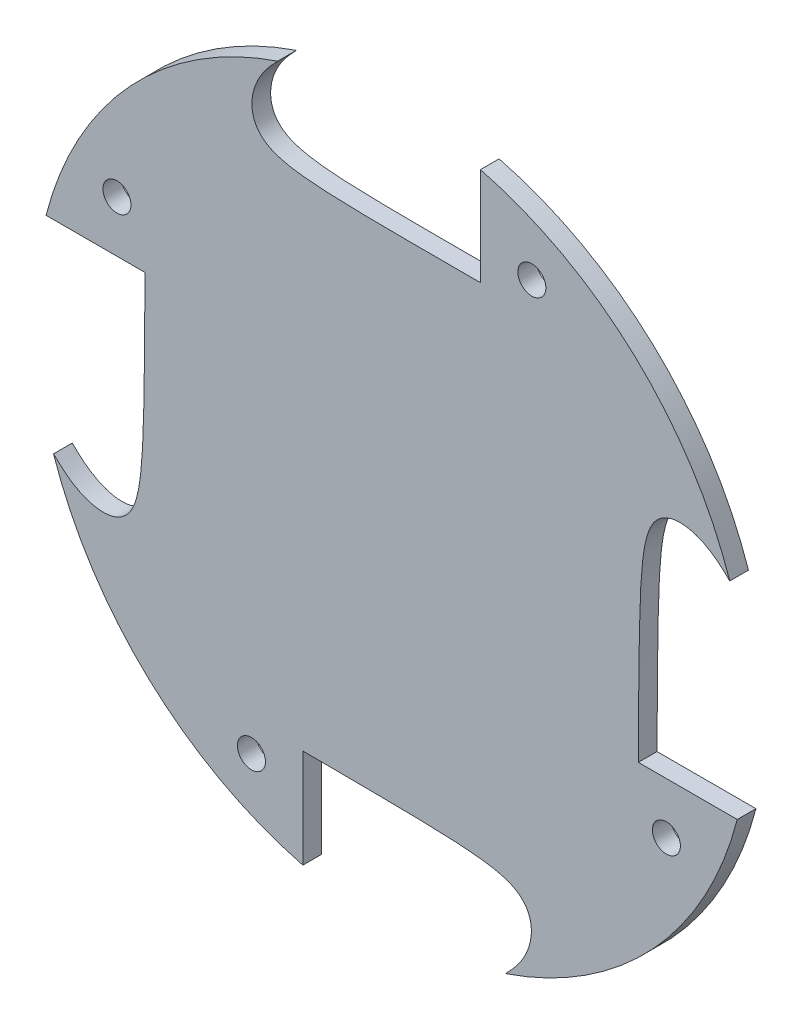
ISO-10303-21;
HEADER;
FILE_DESCRIPTION(('STEP AP214'),'2;1');
FILE_NAME('part.step','',(''),(''),'','','');
FILE_SCHEMA(('AUTOMOTIVE_DESIGN { 1 0 10303 214 1 1 1 1 }'));
ENDSEC;
DATA;
#1=APPLICATION_CONTEXT('core data for automotive mechanical design processes');
#2=APPLICATION_PROTOCOL_DEFINITION('international standard','automotive_design',2000,#1);
#3=PRODUCT_CONTEXT('',#1,'mechanical');
#4=PRODUCT('Part','Part','',(#3));
#5=PRODUCT_RELATED_PRODUCT_CATEGORY('part','',(#4));
#6=PRODUCT_DEFINITION_FORMATION('','',#4);
#7=PRODUCT_DEFINITION_CONTEXT('part definition',#1,'design');
#8=PRODUCT_DEFINITION('design','',#6,#7);
#9=PRODUCT_DEFINITION_SHAPE('','',#8);
#10=(LENGTH_UNIT() NAMED_UNIT(*) SI_UNIT(.MILLI.,.METRE.));
#11=(NAMED_UNIT(*) PLANE_ANGLE_UNIT() SI_UNIT($,.RADIAN.));
#12=(NAMED_UNIT(*) SI_UNIT($,.STERADIAN.) SOLID_ANGLE_UNIT());
#13=UNCERTAINTY_MEASURE_WITH_UNIT(LENGTH_MEASURE(1.E-05),#10,'distance_accuracy_value','');
#14=(GEOMETRIC_REPRESENTATION_CONTEXT(3) GLOBAL_UNCERTAINTY_ASSIGNED_CONTEXT((#13)) GLOBAL_UNIT_ASSIGNED_CONTEXT((#10,
#11,#12)) REPRESENTATION_CONTEXT('',''));
#15=CARTESIAN_POINT('',(0.,0.,0.));
#16=DIRECTION('',(0.,0.,1.));
#17=DIRECTION('',(1.,0.,0.));
#18=AXIS2_PLACEMENT_3D('',#15,#16,#17);
#19=CARTESIAN_POINT('',(24.392810523915,-72.348554199406,4.));
#20=CARTESIAN_POINT('',(27.0406670726884,-69.5410863292131,4.));
#21=CARTESIAN_POINT('',(29.0891629376006,-67.4285749685224,4.));
#22=CARTESIAN_POINT('',(30.2414418616137,-64.3558311711541,4.));
#23=CARTESIAN_POINT('',(31.0736433067342,-60.9630098948933,4.));
#24=CARTESIAN_POINT('',(30.5615193405061,-59.0425450215381,4.));
#25=CARTESIAN_POINT('',(29.2171939291575,-56.6739716777334,4.));
#26=CARTESIAN_POINT('',(27.4887755431378,-54.2413828381502,4.));
#27=CARTESIAN_POINT('',(25.1059549538443,-52.9999999999996,4.));
#28=CARTESIAN_POINT('',(17.3743272101338,-52.9999999999997,4.));
#29=CARTESIAN_POINT('',(-18.9999999999992,-52.782560411168,4.));
#30=B_SPLINE_CURVE_WITH_KNOTS('',10,(#19,#20,#21,#22,#23,#24,#25,#26,#27,#28,#29),.UNSPECIFIED.,
.F.,.F.,(11,11),(0.,1.),.UNSPECIFIED.);
#31=DIRECTION('',(0.,0.,-1.));
#32=VECTOR('',#31,1.);
#33=SURFACE_OF_LINEAR_EXTRUSION('',#30,#32);
#34=CARTESIAN_POINT('',(24.392810523915,-72.348554199406,0.));
#35=CARTESIAN_POINT('',(27.0406670726884,-69.5410863292131,0.));
#36=CARTESIAN_POINT('',(29.0891629376006,-67.4285749685224,0.));
#37=CARTESIAN_POINT('',(30.2414418616137,-64.3558311711541,0.));
#38=CARTESIAN_POINT('',(31.0736433067342,-60.9630098948933,0.));
#39=CARTESIAN_POINT('',(30.5615193405061,-59.0425450215381,0.));
#40=CARTESIAN_POINT('',(29.2171939291575,-56.6739716777334,0.));
#41=CARTESIAN_POINT('',(27.4887755431378,-54.2413828381502,0.));
#42=CARTESIAN_POINT('',(25.1059549538443,-52.9999999999996,0.));
#43=CARTESIAN_POINT('',(17.3743272101338,-52.9999999999997,0.));
#44=CARTESIAN_POINT('',(-18.9999999999992,-52.782560411168,0.));
#45=B_SPLINE_CURVE_WITH_KNOTS('',10,(#34,#35,#36,#37,#38,#39,#40,#41,#42,#43,#44),.UNSPECIFIED.,
.F.,.F.,(11,11),(0.,1.),.UNSPECIFIED.);
#46=CARTESIAN_POINT('',(24.392810523915,-72.348554199406,0.));
#47=VERTEX_POINT('',#46);
#48=CARTESIAN_POINT('',(-18.9999999999992,-52.782560411168,0.));
#49=VERTEX_POINT('',#48);
#50=EDGE_CURVE('E273',#47,#49,#45,.T.);
#51=ORIENTED_EDGE('',*,*,#50,.F.);
#52=DIRECTION('',(0.,0.,-1.));
#53=VECTOR('',#52,1.);
#54=CARTESIAN_POINT('',(24.392810523915,-72.348554199406,4.));
#55=LINE('',#54,#53);
#56=CARTESIAN_POINT('',(24.392810523915,-72.348554199406,4.));
#57=VERTEX_POINT('',#56);
#58=EDGE_CURVE('E11',#57,#47,#55,.T.);
#59=ORIENTED_EDGE('',*,*,#58,.F.);
#60=CARTESIAN_POINT('',(-18.9999999999992,-52.782560411168,4.));
#61=VERTEX_POINT('',#60);
#62=EDGE_CURVE('E323',#57,#61,#30,.T.);
#63=ORIENTED_EDGE('',*,*,#62,.T.);
#64=DIRECTION('',(0.,0.,-1.));
#65=VECTOR('',#64,1.);
#66=CARTESIAN_POINT('',(-18.9999999999992,-52.782560411168,4.));
#67=LINE('',#66,#65);
#68=EDGE_CURVE('E111',#61,#49,#67,.T.);
#69=ORIENTED_EDGE('',*,*,#68,.T.);
#70=EDGE_LOOP('',(#51,#59,#63,#69));
#71=FACE_BOUND('',#70,.T.);
#72=ADVANCED_FACE('F42',(#71),#33,.T.);
#73=CARTESIAN_POINT('',(0.,0.,4.));
#74=DIRECTION('',(0.,0.,-1.));
#75=DIRECTION('',(-1.,0.,0.));
#76=AXIS2_PLACEMENT_3D('',#73,#74,#75);
#77=CYLINDRICAL_SURFACE('',#76,76.35);
#78=CARTESIAN_POINT('',(0.,0.,0.));
#79=DIRECTION('',(0.,0.,1.));
#80=DIRECTION('',(1.,0.,0.));
#81=AXIS2_PLACEMENT_3D('',#78,#79,#80);
#82=CIRCLE('',#81,76.35);
#83=CARTESIAN_POINT('',(73.9481068047045,-19.0000000000005,0.));
#84=VERTEX_POINT('',#83);
#85=EDGE_CURVE('E263',#47,#84,#82,.T.);
#86=ORIENTED_EDGE('',*,*,#85,.T.);
#87=DIRECTION('',(0.,0.,-1.));
#88=VECTOR('',#87,1.);
#89=CARTESIAN_POINT('',(73.9481068047045,-19.0000000000005,4.));
#90=LINE('',#89,#88);
#91=CARTESIAN_POINT('',(73.9481068047045,-19.0000000000005,4.));
#92=VERTEX_POINT('',#91);
#93=EDGE_CURVE('E51',#92,#84,#90,.T.);
#94=ORIENTED_EDGE('',*,*,#93,.F.);
#95=CARTESIAN_POINT('',(0.,0.,4.));
#96=DIRECTION('',(0.,0.,1.));
#97=DIRECTION('',(1.,0.,0.));
#98=AXIS2_PLACEMENT_3D('',#95,#96,#97);
#99=CIRCLE('',#98,76.35);
#100=EDGE_CURVE('E409',#57,#92,#99,.T.);
#101=ORIENTED_EDGE('',*,*,#100,.F.);
#102=ORIENTED_EDGE('',*,*,#58,.T.);
#103=EDGE_LOOP('',(#86,#94,#101,#102));
#104=FACE_BOUND('',#103,.T.);
#105=ADVANCED_FACE('F372',(#104),#77,.T.);
#106=CARTESIAN_POINT('',(0.,-19.0000000000005,4.));
#107=DIRECTION('',(0.,-1.,0.));
#108=DIRECTION('',(0.,0.,-1.));
#109=AXIS2_PLACEMENT_3D('',#106,#107,#108);
#110=PLANE('',#109);
#111=DIRECTION('',(-1.,0.,0.));
#112=VECTOR('',#111,1.);
#113=CARTESIAN_POINT('',(0.,-19.0000000000005,0.));
#114=LINE('',#113,#112);
#115=CARTESIAN_POINT('',(52.7825604111679,-19.0000000000005,0.));
#116=VERTEX_POINT('',#115);
#117=EDGE_CURVE('E254',#84,#116,#114,.T.);
#118=ORIENTED_EDGE('',*,*,#117,.T.);
#119=DIRECTION('',(0.,0.,-1.));
#120=VECTOR('',#119,1.);
#121=CARTESIAN_POINT('',(52.7825604111679,-19.0000000000005,4.));
#122=LINE('',#121,#120);
#123=CARTESIAN_POINT('',(52.7825604111679,-19.0000000000005,4.));
#124=VERTEX_POINT('',#123);
#125=EDGE_CURVE('E242',#124,#116,#122,.T.);
#126=ORIENTED_EDGE('',*,*,#125,.F.);
#127=DIRECTION('',(-1.,0.,0.));
#128=VECTOR('',#127,1.);
#129=CARTESIAN_POINT('',(0.,-19.0000000000005,4.));
#130=LINE('',#129,#128);
#131=EDGE_CURVE('E256',#92,#124,#130,.T.);
#132=ORIENTED_EDGE('',*,*,#131,.F.);
#133=ORIENTED_EDGE('',*,*,#93,.T.);
#134=EDGE_LOOP('',(#118,#126,#132,#133));
#135=FACE_BOUND('',#134,.T.);
#136=ADVANCED_FACE('F252',(#135),#110,.F.);
#137=CARTESIAN_POINT('',(72.3485541994065,24.3928105239135,4.));
#138=CARTESIAN_POINT('',(69.5410863292133,27.0406670726869,4.));
#139=CARTESIAN_POINT('',(67.4285749685226,29.0891629375991,4.));
#140=CARTESIAN_POINT('',(64.3558311711543,30.2414418616122,4.));
#141=CARTESIAN_POINT('',(60.9630098948935,31.0736433067328,4.));
#142=CARTESIAN_POINT('',(59.0425450215383,30.5615193405047,4.));
#143=CARTESIAN_POINT('',(56.6739716777336,29.217193929156,4.));
#144=CARTESIAN_POINT('',(54.2413828381504,27.4887755431363,4.));
#145=CARTESIAN_POINT('',(52.9999999999998,25.1059549538429,4.));
#146=CARTESIAN_POINT('',(52.9999999999999,17.3743272101324,4.));
#147=CARTESIAN_POINT('',(52.7825604111679,-19.0000000000005,4.));
#148=B_SPLINE_CURVE_WITH_KNOTS('',10,(#137,#138,#139,#140,#141,#142,#143,#144,#145,#146,#147),
.UNSPECIFIED.,.F.,.F.,(11,11),(0.,1.),.UNSPECIFIED.);
#149=DIRECTION('',(0.,0.,-1.));
#150=VECTOR('',#149,1.);
#151=SURFACE_OF_LINEAR_EXTRUSION('',#148,#150);
#152=CARTESIAN_POINT('',(72.3485541994065,24.3928105239135,0.));
#153=CARTESIAN_POINT('',(69.5410863292133,27.0406670726869,0.));
#154=CARTESIAN_POINT('',(67.4285749685226,29.0891629375991,0.));
#155=CARTESIAN_POINT('',(64.3558311711543,30.2414418616122,0.));
#156=CARTESIAN_POINT('',(60.9630098948935,31.0736433067328,0.));
#157=CARTESIAN_POINT('',(59.0425450215383,30.5615193405047,0.));
#158=CARTESIAN_POINT('',(56.6739716777336,29.217193929156,0.));
#159=CARTESIAN_POINT('',(54.2413828381504,27.4887755431363,0.));
#160=CARTESIAN_POINT('',(52.9999999999998,25.1059549538429,0.));
#161=CARTESIAN_POINT('',(52.9999999999999,17.3743272101324,0.));
#162=CARTESIAN_POINT('',(52.7825604111679,-19.0000000000005,0.));
#163=B_SPLINE_CURVE_WITH_KNOTS('',10,(#152,#153,#154,#155,#156,#157,#158,#159,#160,#161,#162),
.UNSPECIFIED.,.F.,.F.,(11,11),(0.,1.),.UNSPECIFIED.);
#164=CARTESIAN_POINT('',(72.3485541994065,24.3928105239135,0.));
#165=VERTEX_POINT('',#164);
#166=EDGE_CURVE('E266',#165,#116,#163,.T.);
#167=ORIENTED_EDGE('',*,*,#166,.F.);
#168=DIRECTION('',(0.,0.,-1.));
#169=VECTOR('',#168,1.);
#170=CARTESIAN_POINT('',(72.3485541994065,24.3928105239135,4.));
#171=LINE('',#170,#169);
#172=CARTESIAN_POINT('',(72.3485541994065,24.3928105239135,4.));
#173=VERTEX_POINT('',#172);
#174=EDGE_CURVE('E240',#173,#165,#171,.T.);
#175=ORIENTED_EDGE('',*,*,#174,.F.);
#176=EDGE_CURVE('E386',#173,#124,#148,.T.);
#177=ORIENTED_EDGE('',*,*,#176,.T.);
#178=ORIENTED_EDGE('',*,*,#125,.T.);
#179=EDGE_LOOP('',(#167,#175,#177,#178));
#180=FACE_BOUND('',#179,.T.);
#181=ADVANCED_FACE('F379',(#180),#151,.T.);
#182=CARTESIAN_POINT('',(0.,0.,4.));
#183=DIRECTION('',(0.,0.,-1.));
#184=DIRECTION('',(-1.,0.,0.));
#185=AXIS2_PLACEMENT_3D('',#182,#183,#184);
#186=CYLINDRICAL_SURFACE('',#185,76.35);
#187=CARTESIAN_POINT('',(0.,0.,0.));
#188=DIRECTION('',(0.,0.,1.));
#189=DIRECTION('',(1.,0.,0.));
#190=AXIS2_PLACEMENT_3D('',#187,#188,#189);
#191=CIRCLE('',#190,76.35);
#192=CARTESIAN_POINT('',(19.0000000000008,73.9481068047044,0.));
#193=VERTEX_POINT('',#192);
#194=EDGE_CURVE('E270',#165,#193,#191,.T.);
#195=ORIENTED_EDGE('',*,*,#194,.T.);
#196=DIRECTION('',(0.,0.,-1.));
#197=VECTOR('',#196,1.);
#198=CARTESIAN_POINT('',(19.0000000000008,73.9481068047044,4.));
#199=LINE('',#198,#197);
#200=CARTESIAN_POINT('',(19.0000000000008,73.9481068047044,4.));
#201=VERTEX_POINT('',#200);
#202=EDGE_CURVE('E236',#201,#193,#199,.T.);
#203=ORIENTED_EDGE('',*,*,#202,.F.);
#204=CARTESIAN_POINT('',(0.,0.,4.));
#205=DIRECTION('',(0.,0.,1.));
#206=DIRECTION('',(1.,0.,0.));
#207=AXIS2_PLACEMENT_3D('',#204,#205,#206);
#208=CIRCLE('',#207,76.35);
#209=EDGE_CURVE('E393',#173,#201,#208,.T.);
#210=ORIENTED_EDGE('',*,*,#209,.F.);
#211=ORIENTED_EDGE('',*,*,#174,.T.);
#212=EDGE_LOOP('',(#195,#203,#210,#211));
#213=FACE_BOUND('',#212,.T.);
#214=ADVANCED_FACE('F384',(#213),#186,.T.);
#215=CARTESIAN_POINT('',(19.0000000000008,0.,4.));
#216=DIRECTION('',(1.,0.,0.));
#217=DIRECTION('',(0.,0.,-1.));
#218=AXIS2_PLACEMENT_3D('',#215,#216,#217);
#219=PLANE('',#218);
#220=DIRECTION('',(0.,-1.,0.));
#221=VECTOR('',#220,1.);
#222=CARTESIAN_POINT('',(19.0000000000008,0.,0.));
#223=LINE('',#222,#221);
#224=CARTESIAN_POINT('',(19.0000000000008,53.,0.));
#225=VERTEX_POINT('',#224);
#226=EDGE_CURVE('E284',#193,#225,#223,.T.);
#227=ORIENTED_EDGE('',*,*,#226,.T.);
#228=DIRECTION('',(0.,0.,-1.));
#229=VECTOR('',#228,1.);
#230=CARTESIAN_POINT('',(19.0000000000008,53.,4.));
#231=LINE('',#230,#229);
#232=CARTESIAN_POINT('',(19.0000000000008,53.,4.));
#233=VERTEX_POINT('',#232);
#234=EDGE_CURVE('E234',#233,#225,#231,.T.);
#235=ORIENTED_EDGE('',*,*,#234,.F.);
#236=DIRECTION('',(0.,-1.,0.));
#237=VECTOR('',#236,1.);
#238=CARTESIAN_POINT('',(19.0000000000008,0.,4.));
#239=LINE('',#238,#237);
#240=EDGE_CURVE('E209',#201,#233,#239,.T.);
#241=ORIENTED_EDGE('',*,*,#240,.F.);
#242=ORIENTED_EDGE('',*,*,#202,.T.);
#243=EDGE_LOOP('',(#227,#235,#241,#242));
#244=FACE_BOUND('',#243,.T.);
#245=ADVANCED_FACE('F199',(#244),#219,.F.);
#246=CARTESIAN_POINT('',(-24.3928105239137,72.3485541994064,4.));
#247=CARTESIAN_POINT('',(-27.0406670726872,69.5410863292135,4.));
#248=CARTESIAN_POINT('',(-29.0891629375994,67.4285749685228,4.));
#249=CARTESIAN_POINT('',(-30.2414418616125,64.3558311711545,4.));
#250=CARTESIAN_POINT('',(-31.073643306733,60.9630098948937,4.));
#251=CARTESIAN_POINT('',(-30.561519340505,59.0425450215385,4.));
#252=CARTESIAN_POINT('',(-29.2171939291564,56.6739716777338,4.));
#253=CARTESIAN_POINT('',(-27.4887755431367,54.2413828381506,4.));
#254=CARTESIAN_POINT('',(-25.1059549538432,53.,4.));
#255=CARTESIAN_POINT('',(-17.3743272101327,53.,4.));
#256=CARTESIAN_POINT('',(19.0000000000008,53.,4.));
#257=B_SPLINE_CURVE_WITH_KNOTS('',10,(#246,#247,#248,#249,#250,#251,#252,#253,#254,#255,#256),
.UNSPECIFIED.,.F.,.F.,(11,11),(0.,1.),.UNSPECIFIED.);
#258=DIRECTION('',(0.,0.,-1.));
#259=VECTOR('',#258,1.);
#260=SURFACE_OF_LINEAR_EXTRUSION('',#257,#259);
#261=CARTESIAN_POINT('',(-24.3928105239137,72.3485541994064,0.));
#262=CARTESIAN_POINT('',(-27.0406670726872,69.5410863292135,0.));
#263=CARTESIAN_POINT('',(-29.0891629375994,67.4285749685228,0.));
#264=CARTESIAN_POINT('',(-30.2414418616125,64.3558311711545,0.));
#265=CARTESIAN_POINT('',(-31.073643306733,60.9630098948937,0.));
#266=CARTESIAN_POINT('',(-30.561519340505,59.0425450215385,0.));
#267=CARTESIAN_POINT('',(-29.2171939291564,56.6739716777338,0.));
#268=CARTESIAN_POINT('',(-27.4887755431367,54.2413828381506,0.));
#269=CARTESIAN_POINT('',(-25.1059549538432,53.,0.));
#270=CARTESIAN_POINT('',(-17.3743272101327,53.,0.));
#271=CARTESIAN_POINT('',(19.0000000000008,53.,0.));
#272=B_SPLINE_CURVE_WITH_KNOTS('',10,(#261,#262,#263,#264,#265,#266,#267,#268,#269,#270,#271),
.UNSPECIFIED.,.F.,.F.,(11,11),(0.,1.),.UNSPECIFIED.);
#273=CARTESIAN_POINT('',(-24.3928105239137,72.3485541994064,0.));
#274=VERTEX_POINT('',#273);
#275=EDGE_CURVE('E288',#274,#225,#272,.T.);
#276=ORIENTED_EDGE('',*,*,#275,.F.);
#277=DIRECTION('',(0.,0.,-1.));
#278=VECTOR('',#277,1.);
#279=CARTESIAN_POINT('',(-24.3928105239137,72.3485541994064,4.));
#280=LINE('',#279,#278);
#281=CARTESIAN_POINT('',(-24.3928105239137,72.3485541994064,4.));
#282=VERTEX_POINT('',#281);
#283=EDGE_CURVE('E226',#282,#274,#280,.T.);
#284=ORIENTED_EDGE('',*,*,#283,.F.);
#285=EDGE_CURVE('E202',#282,#233,#257,.T.);
#286=ORIENTED_EDGE('',*,*,#285,.T.);
#287=ORIENTED_EDGE('',*,*,#234,.T.);
#288=EDGE_LOOP('',(#276,#284,#286,#287));
#289=FACE_BOUND('',#288,.T.);
#290=ADVANCED_FACE('F194',(#289),#260,.T.);
#291=CARTESIAN_POINT('',(0.,0.,4.));
#292=DIRECTION('',(0.,0.,-1.));
#293=DIRECTION('',(-1.,0.,0.));
#294=AXIS2_PLACEMENT_3D('',#291,#292,#293);
#295=CYLINDRICAL_SURFACE('',#294,76.35);
#296=CARTESIAN_POINT('',(0.,0.,0.));
#297=DIRECTION('',(0.,0.,1.));
#298=DIRECTION('',(1.,0.,0.));
#299=AXIS2_PLACEMENT_3D('',#296,#297,#298);
#300=CIRCLE('',#299,76.35);
#301=CARTESIAN_POINT('',(-73.9481068047048,18.9999999999995,0.));
#302=VERTEX_POINT('',#301);
#303=EDGE_CURVE('E223',#274,#302,#300,.T.);
#304=ORIENTED_EDGE('',*,*,#303,.T.);
#305=DIRECTION('',(0.,0.,-1.));
#306=VECTOR('',#305,1.);
#307=CARTESIAN_POINT('',(-73.9481068047048,18.9999999999995,4.));
#308=LINE('',#307,#306);
#309=CARTESIAN_POINT('',(-73.9481068047048,18.9999999999995,4.));
#310=VERTEX_POINT('',#309);
#311=EDGE_CURVE('E221',#310,#302,#308,.T.);
#312=ORIENTED_EDGE('',*,*,#311,.F.);
#313=CARTESIAN_POINT('',(0.,0.,4.));
#314=DIRECTION('',(0.,0.,1.));
#315=DIRECTION('',(1.,0.,0.));
#316=AXIS2_PLACEMENT_3D('',#313,#314,#315);
#317=CIRCLE('',#316,76.35);
#318=EDGE_CURVE('E172',#282,#310,#317,.T.);
#319=ORIENTED_EDGE('',*,*,#318,.F.);
#320=ORIENTED_EDGE('',*,*,#283,.T.);
#321=EDGE_LOOP('',(#304,#312,#319,#320));
#322=FACE_BOUND('',#321,.T.);
#323=ADVANCED_FACE('F190',(#322),#295,.T.);
#324=CARTESIAN_POINT('',(0.,18.9999999999995,4.));
#325=DIRECTION('',(0.,1.,0.));
#326=DIRECTION('',(0.,0.,1.));
#327=AXIS2_PLACEMENT_3D('',#324,#325,#326);
#328=PLANE('',#327);
#329=DIRECTION('',(1.,0.,0.));
#330=VECTOR('',#329,1.);
#331=CARTESIAN_POINT('',(0.,18.9999999999995,0.));
#332=LINE('',#331,#330);
#333=CARTESIAN_POINT('',(-52.7825604111669,18.9999999999995,0.));
#334=VERTEX_POINT('',#333);
#335=EDGE_CURVE('E228',#302,#334,#332,.T.);
#336=ORIENTED_EDGE('',*,*,#335,.T.);
#337=DIRECTION('',(0.,0.,-1.));
#338=VECTOR('',#337,1.);
#339=CARTESIAN_POINT('',(-52.7825604111669,18.9999999999995,4.));
#340=LINE('',#339,#338);
#341=CARTESIAN_POINT('',(-52.7825604111669,18.9999999999995,4.));
#342=VERTEX_POINT('',#341);
#343=EDGE_CURVE('E155',#342,#334,#340,.T.);
#344=ORIENTED_EDGE('',*,*,#343,.F.);
#345=DIRECTION('',(1.,0.,0.));
#346=VECTOR('',#345,1.);
#347=CARTESIAN_POINT('',(0.,18.9999999999995,4.));
#348=LINE('',#347,#346);
#349=EDGE_CURVE('E165',#310,#342,#348,.T.);
#350=ORIENTED_EDGE('',*,*,#349,.F.);
#351=ORIENTED_EDGE('',*,*,#311,.T.);
#352=EDGE_LOOP('',(#336,#344,#350,#351));
#353=FACE_BOUND('',#352,.T.);
#354=ADVANCED_FACE('F186',(#353),#328,.F.);
#355=CARTESIAN_POINT('',(-72.3485541994062,-24.3928105239142,4.));
#356=CARTESIAN_POINT('',(-69.5410863292124,-27.0406670726874,4.));
#357=CARTESIAN_POINT('',(-67.4285749685217,-29.0891629375996,4.));
#358=CARTESIAN_POINT('',(-64.3558311711534,-30.2414418616126,4.));
#359=CARTESIAN_POINT('',(-60.9630098948926,-31.0736433067332,4.));
#360=CARTESIAN_POINT('',(-59.0425450215374,-30.5615193405052,4.));
#361=CARTESIAN_POINT('',(-56.6739716777327,-29.2171939291566,4.));
#362=CARTESIAN_POINT('',(-54.2413828381494,-27.4887755431368,4.));
#363=CARTESIAN_POINT('',(-52.9999999999989,-25.1059549538434,4.));
#364=CARTESIAN_POINT('',(-52.9999999999989,-17.3743272101329,4.));
#365=CARTESIAN_POINT('',(-52.7825604111669,18.9999999999995,4.));
#366=B_SPLINE_CURVE_WITH_KNOTS('',10,(#355,#356,#357,#358,#359,#360,#361,#362,#363,#364,#365),
.UNSPECIFIED.,.F.,.F.,(11,11),(0.,1.),.UNSPECIFIED.);
#367=DIRECTION('',(0.,0.,-1.));
#368=VECTOR('',#367,1.);
#369=SURFACE_OF_LINEAR_EXTRUSION('',#366,#368);
#370=CARTESIAN_POINT('',(-72.3485541994062,-24.3928105239142,0.));
#371=CARTESIAN_POINT('',(-69.5410863292124,-27.0406670726874,0.));
#372=CARTESIAN_POINT('',(-67.4285749685217,-29.0891629375996,0.));
#373=CARTESIAN_POINT('',(-64.3558311711534,-30.2414418616126,0.));
#374=CARTESIAN_POINT('',(-60.9630098948926,-31.0736433067332,0.));
#375=CARTESIAN_POINT('',(-59.0425450215374,-30.5615193405052,0.));
#376=CARTESIAN_POINT('',(-56.6739716777327,-29.2171939291566,0.));
#377=CARTESIAN_POINT('',(-54.2413828381494,-27.4887755431368,0.));
#378=CARTESIAN_POINT('',(-52.9999999999989,-25.1059549538434,0.));
#379=CARTESIAN_POINT('',(-52.9999999999989,-17.3743272101329,0.));
#380=CARTESIAN_POINT('',(-52.7825604111669,18.9999999999995,0.));
#381=B_SPLINE_CURVE_WITH_KNOTS('',10,(#370,#371,#372,#373,#374,#375,#376,#377,#378,#379,#380),
.UNSPECIFIED.,.F.,.F.,(11,11),(0.,1.),.UNSPECIFIED.);
#382=CARTESIAN_POINT('',(-72.3485541994062,-24.3928105239142,0.));
#383=VERTEX_POINT('',#382);
#384=EDGE_CURVE('E154',#383,#334,#381,.T.);
#385=ORIENTED_EDGE('',*,*,#384,.F.);
#386=DIRECTION('',(0.,0.,-1.));
#387=VECTOR('',#386,1.);
#388=CARTESIAN_POINT('',(-72.3485541994062,-24.3928105239142,4.));
#389=LINE('',#388,#387);
#390=CARTESIAN_POINT('',(-72.3485541994062,-24.3928105239142,4.));
#391=VERTEX_POINT('',#390);
#392=EDGE_CURVE('E148',#391,#383,#389,.T.);
#393=ORIENTED_EDGE('',*,*,#392,.F.);
#394=EDGE_CURVE('E152',#391,#342,#366,.T.);
#395=ORIENTED_EDGE('',*,*,#394,.T.);
#396=ORIENTED_EDGE('',*,*,#343,.T.);
#397=EDGE_LOOP('',(#385,#393,#395,#396));
#398=FACE_BOUND('',#397,.T.);
#399=ADVANCED_FACE('F150',(#398),#369,.T.);
#400=CARTESIAN_POINT('',(0.,0.,4.));
#401=DIRECTION('',(0.,0.,-1.));
#402=DIRECTION('',(-1.,0.,0.));
#403=AXIS2_PLACEMENT_3D('',#400,#401,#402);
#404=CYLINDRICAL_SURFACE('',#403,76.35);
#405=CARTESIAN_POINT('',(0.,0.,0.));
#406=DIRECTION('',(0.,0.,1.));
#407=DIRECTION('',(1.,0.,0.));
#408=AXIS2_PLACEMENT_3D('',#405,#406,#407);
#409=CIRCLE('',#408,76.35);
#410=CARTESIAN_POINT('',(-18.9999999999992,-73.9481068047048,0.));
#411=VERTEX_POINT('',#410);
#412=EDGE_CURVE('E104',#383,#411,#409,.T.);
#413=ORIENTED_EDGE('',*,*,#412,.T.);
#414=DIRECTION('',(0.,0.,-1.));
#415=VECTOR('',#414,1.);
#416=CARTESIAN_POINT('',(-18.9999999999992,-73.9481068047048,4.));
#417=LINE('',#416,#415);
#418=CARTESIAN_POINT('',(-18.9999999999992,-73.9481068047048,4.));
#419=VERTEX_POINT('',#418);
#420=EDGE_CURVE('E156',#419,#411,#417,.T.);
#421=ORIENTED_EDGE('',*,*,#420,.F.);
#422=CARTESIAN_POINT('',(0.,0.,4.));
#423=DIRECTION('',(0.,0.,1.));
#424=DIRECTION('',(1.,0.,0.));
#425=AXIS2_PLACEMENT_3D('',#422,#423,#424);
#426=CIRCLE('',#425,76.35);
#427=EDGE_CURVE('E158',#391,#419,#426,.T.);
#428=ORIENTED_EDGE('',*,*,#427,.F.);
#429=ORIENTED_EDGE('',*,*,#392,.T.);
#430=EDGE_LOOP('',(#413,#421,#428,#429));
#431=FACE_BOUND('',#430,.T.);
#432=ADVANCED_FACE('F159',(#431),#404,.T.);
#433=CARTESIAN_POINT('',(58.7825604111679,-29.9999999999995,4.));
#434=DIRECTION('',(0.,0.,-1.));
#435=DIRECTION('',(-1.,0.,0.));
#436=AXIS2_PLACEMENT_3D('',#433,#434,#435);
#437=CYLINDRICAL_SURFACE('',#436,3.00000000000001);
#438=CARTESIAN_POINT('',(58.7825604111679,-29.9999999999995,4.));
#439=DIRECTION('',(0.,0.,1.));
#440=DIRECTION('',(1.,0.,0.));
#441=AXIS2_PLACEMENT_3D('',#438,#439,#440);
#442=CIRCLE('',#441,3.00000000000001);
#443=CARTESIAN_POINT('',(61.7825604111679,-29.9999999999995,4.));
#444=VERTEX_POINT('',#443);
#445=EDGE_CURVE('E339',#444,#444,#442,.T.);
#446=ORIENTED_EDGE('',*,*,#445,.T.);
#447=EDGE_LOOP('',(#446));
#448=FACE_BOUND('',#447,.T.);
#449=CARTESIAN_POINT('',(58.7825604111679,-29.9999999999995,0.));
#450=DIRECTION('',(0.,0.,1.));
#451=DIRECTION('',(1.,0.,0.));
#452=AXIS2_PLACEMENT_3D('',#449,#450,#451);
#453=CIRCLE('',#452,3.00000000000001);
#454=CARTESIAN_POINT('',(61.7825604111679,-29.9999999999995,0.));
#455=VERTEX_POINT('',#454);
#456=EDGE_CURVE('E317',#455,#455,#453,.T.);
#457=ORIENTED_EDGE('',*,*,#456,.F.);
#458=EDGE_LOOP('',(#457));
#459=FACE_BOUND('',#458,.T.);
#460=ADVANCED_FACE('F445',(#448,#459),#437,.F.);
#461=CARTESIAN_POINT('',(-58.7825604111669,29.9999999999995,4.));
#462=DIRECTION('',(0.,0.,-1.));
#463=DIRECTION('',(-1.,0.,0.));
#464=AXIS2_PLACEMENT_3D('',#461,#462,#463);
#465=CYLINDRICAL_SURFACE('',#464,3.);
#466=CARTESIAN_POINT('',(-58.7825604111669,29.9999999999995,4.));
#467=DIRECTION('',(0.,0.,1.));
#468=DIRECTION('',(1.,0.,0.));
#469=AXIS2_PLACEMENT_3D('',#466,#467,#468);
#470=CIRCLE('',#469,3.);
#471=CARTESIAN_POINT('',(-55.7825604111669,29.9999999999995,4.));
#472=VERTEX_POINT('',#471);
#473=EDGE_CURVE('E342',#472,#472,#470,.T.);
#474=ORIENTED_EDGE('',*,*,#473,.T.);
#475=EDGE_LOOP('',(#474));
#476=FACE_BOUND('',#475,.T.);
#477=CARTESIAN_POINT('',(-58.7825604111669,29.9999999999995,0.));
#478=DIRECTION('',(0.,0.,1.));
#479=DIRECTION('',(1.,0.,0.));
#480=AXIS2_PLACEMENT_3D('',#477,#478,#479);
#481=CIRCLE('',#480,3.);
#482=CARTESIAN_POINT('',(-55.7825604111669,29.9999999999995,0.));
#483=VERTEX_POINT('',#482);
#484=EDGE_CURVE('E314',#483,#483,#481,.T.);
#485=ORIENTED_EDGE('',*,*,#484,.F.);
#486=EDGE_LOOP('',(#485));
#487=FACE_BOUND('',#486,.T.);
#488=ADVANCED_FACE('F451',(#476,#487),#465,.F.);
#489=CARTESIAN_POINT('',(30.,59.,4.));
#490=DIRECTION('',(0.,0.,-1.));
#491=DIRECTION('',(-1.,0.,0.));
#492=AXIS2_PLACEMENT_3D('',#489,#490,#491);
#493=CYLINDRICAL_SURFACE('',#492,3.);
#494=CARTESIAN_POINT('',(30.,59.,4.));
#495=DIRECTION('',(0.,0.,1.));
#496=DIRECTION('',(1.,0.,0.));
#497=AXIS2_PLACEMENT_3D('',#494,#495,#496);
#498=CIRCLE('',#497,3.);
#499=CARTESIAN_POINT('',(33.,59.,4.));
#500=VERTEX_POINT('',#499);
#501=EDGE_CURVE('E346',#500,#500,#498,.T.);
#502=ORIENTED_EDGE('',*,*,#501,.T.);
#503=EDGE_LOOP('',(#502));
#504=FACE_BOUND('',#503,.T.);
#505=CARTESIAN_POINT('',(30.,59.,0.));
#506=DIRECTION('',(0.,0.,1.));
#507=DIRECTION('',(1.,0.,0.));
#508=AXIS2_PLACEMENT_3D('',#505,#506,#507);
#509=CIRCLE('',#508,3.);
#510=CARTESIAN_POINT('',(33.,59.,0.));
#511=VERTEX_POINT('',#510);
#512=EDGE_CURVE('E311',#511,#511,#509,.T.);
#513=ORIENTED_EDGE('',*,*,#512,.F.);
#514=EDGE_LOOP('',(#513));
#515=FACE_BOUND('',#514,.T.);
#516=ADVANCED_FACE('F351',(#504,#515),#493,.F.);
#517=CARTESIAN_POINT('',(-18.9999999999992,0.,4.));
#518=DIRECTION('',(-1.,0.,0.));
#519=DIRECTION('',(0.,0.,1.));
#520=AXIS2_PLACEMENT_3D('',#517,#518,#519);
#521=PLANE('',#520);
#522=DIRECTION('',(0.,1.,0.));
#523=VECTOR('',#522,1.);
#524=CARTESIAN_POINT('',(-18.9999999999992,0.,0.));
#525=LINE('',#524,#523);
#526=EDGE_CURVE('E308',#411,#49,#525,.T.);
#527=ORIENTED_EDGE('',*,*,#526,.T.);
#528=ORIENTED_EDGE('',*,*,#68,.F.);
#529=DIRECTION('',(0.,1.,0.));
#530=VECTOR('',#529,1.);
#531=CARTESIAN_POINT('',(-18.9999999999992,0.,4.));
#532=LINE('',#531,#530);
#533=EDGE_CURVE('E59',#419,#61,#532,.T.);
#534=ORIENTED_EDGE('',*,*,#533,.F.);
#535=ORIENTED_EDGE('',*,*,#420,.T.);
#536=EDGE_LOOP('',(#527,#528,#534,#535));
#537=FACE_BOUND('',#536,.T.);
#538=ADVANCED_FACE('F328',(#537),#521,.F.);
#539=CARTESIAN_POINT('',(-30.0000000000008,-58.782560411168,4.));
#540=DIRECTION('',(0.,0.,-1.));
#541=DIRECTION('',(-1.,0.,0.));
#542=AXIS2_PLACEMENT_3D('',#539,#540,#541);
#543=CYLINDRICAL_SURFACE('',#542,3.);
#544=CARTESIAN_POINT('',(-30.0000000000008,-58.782560411168,4.));
#545=DIRECTION('',(0.,0.,1.));
#546=DIRECTION('',(1.,0.,0.));
#547=AXIS2_PLACEMENT_3D('',#544,#545,#546);
#548=CIRCLE('',#547,3.);
#549=CARTESIAN_POINT('',(-27.0000000000008,-58.782560411168,4.));
#550=VERTEX_POINT('',#549);
#551=EDGE_CURVE('E324',#550,#550,#548,.T.);
#552=ORIENTED_EDGE('',*,*,#551,.T.);
#553=EDGE_LOOP('',(#552));
#554=FACE_BOUND('',#553,.T.);
#555=CARTESIAN_POINT('',(-30.0000000000008,-58.782560411168,0.));
#556=DIRECTION('',(0.,0.,1.));
#557=DIRECTION('',(1.,0.,0.));
#558=AXIS2_PLACEMENT_3D('',#555,#556,#557);
#559=CIRCLE('',#558,3.);
#560=CARTESIAN_POINT('',(-27.0000000000008,-58.782560411168,0.));
#561=VERTEX_POINT('',#560);
#562=EDGE_CURVE('E320',#561,#561,#559,.T.);
#563=ORIENTED_EDGE('',*,*,#562,.F.);
#564=EDGE_LOOP('',(#563));
#565=FACE_BOUND('',#564,.T.);
#566=ADVANCED_FACE('F355',(#554,#565),#543,.F.);
#567=CARTESIAN_POINT('',(0.,0.,4.));
#568=DIRECTION('',(0.,0.,1.));
#569=DIRECTION('',(1.,0.,0.));
#570=AXIS2_PLACEMENT_3D('',#567,#568,#569);
#571=PLANE('',#570);
#572=ORIENTED_EDGE('',*,*,#62,.F.);
#573=ORIENTED_EDGE('',*,*,#100,.T.);
#574=ORIENTED_EDGE('',*,*,#131,.T.);
#575=ORIENTED_EDGE('',*,*,#176,.F.);
#576=ORIENTED_EDGE('',*,*,#209,.T.);
#577=ORIENTED_EDGE('',*,*,#240,.T.);
#578=ORIENTED_EDGE('',*,*,#285,.F.);
#579=ORIENTED_EDGE('',*,*,#318,.T.);
#580=ORIENTED_EDGE('',*,*,#349,.T.);
#581=ORIENTED_EDGE('',*,*,#394,.F.);
#582=ORIENTED_EDGE('',*,*,#427,.T.);
#583=ORIENTED_EDGE('',*,*,#533,.T.);
#584=EDGE_LOOP('',(#572,#573,#574,#575,#576,#577,#578,#579,#580,#581,#582,#583));
#585=FACE_BOUND('',#584,.T.);
#586=ORIENTED_EDGE('',*,*,#501,.F.);
#587=EDGE_LOOP('',(#586));
#588=FACE_BOUND('',#587,.T.);
#589=ORIENTED_EDGE('',*,*,#473,.F.);
#590=EDGE_LOOP('',(#589));
#591=FACE_BOUND('',#590,.T.);
#592=ORIENTED_EDGE('',*,*,#445,.F.);
#593=EDGE_LOOP('',(#592));
#594=FACE_BOUND('',#593,.T.);
#595=ORIENTED_EDGE('',*,*,#551,.F.);
#596=EDGE_LOOP('',(#595));
#597=FACE_BOUND('',#596,.T.);
#598=ADVANCED_FACE('F162',(#585,#588,#591,#594,#597),#571,.T.);
#599=CARTESIAN_POINT('',(0.,0.,0.));
#600=DIRECTION('',(0.,0.,1.));
#601=DIRECTION('',(1.,0.,0.));
#602=AXIS2_PLACEMENT_3D('',#599,#600,#601);
#603=PLANE('',#602);
#604=ORIENTED_EDGE('',*,*,#50,.T.);
#605=ORIENTED_EDGE('',*,*,#526,.F.);
#606=ORIENTED_EDGE('',*,*,#412,.F.);
#607=ORIENTED_EDGE('',*,*,#384,.T.);
#608=ORIENTED_EDGE('',*,*,#335,.F.);
#609=ORIENTED_EDGE('',*,*,#303,.F.);
#610=ORIENTED_EDGE('',*,*,#275,.T.);
#611=ORIENTED_EDGE('',*,*,#226,.F.);
#612=ORIENTED_EDGE('',*,*,#194,.F.);
#613=ORIENTED_EDGE('',*,*,#166,.T.);
#614=ORIENTED_EDGE('',*,*,#117,.F.);
#615=ORIENTED_EDGE('',*,*,#85,.F.);
#616=EDGE_LOOP('',(#604,#605,#606,#607,#608,#609,#610,#611,#612,#613,#614,#615));
#617=FACE_BOUND('',#616,.T.);
#618=ORIENTED_EDGE('',*,*,#512,.T.);
#619=EDGE_LOOP('',(#618));
#620=FACE_BOUND('',#619,.T.);
#621=ORIENTED_EDGE('',*,*,#484,.T.);
#622=EDGE_LOOP('',(#621));
#623=FACE_BOUND('',#622,.T.);
#624=ORIENTED_EDGE('',*,*,#456,.T.);
#625=EDGE_LOOP('',(#624));
#626=FACE_BOUND('',#625,.T.);
#627=ORIENTED_EDGE('',*,*,#562,.T.);
#628=EDGE_LOOP('',(#627));
#629=FACE_BOUND('',#628,.T.);
#630=ADVANCED_FACE('F261',(#617,#620,#623,#626,#629),#603,.F.);
#631=CLOSED_SHELL('',(#72,#105,#136,#181,#214,#245,#290,#323,#354,#399,#432,#460,#488,#516,#538,
#566,#598,#630));
#632=MANIFOLD_SOLID_BREP('B2',#631);
#633=ADVANCED_BREP_SHAPE_REPRESENTATION('',(#18,#632),#14);
#634=SHAPE_DEFINITION_REPRESENTATION(#9,#633);
ENDSEC;
END-ISO-10303-21;
